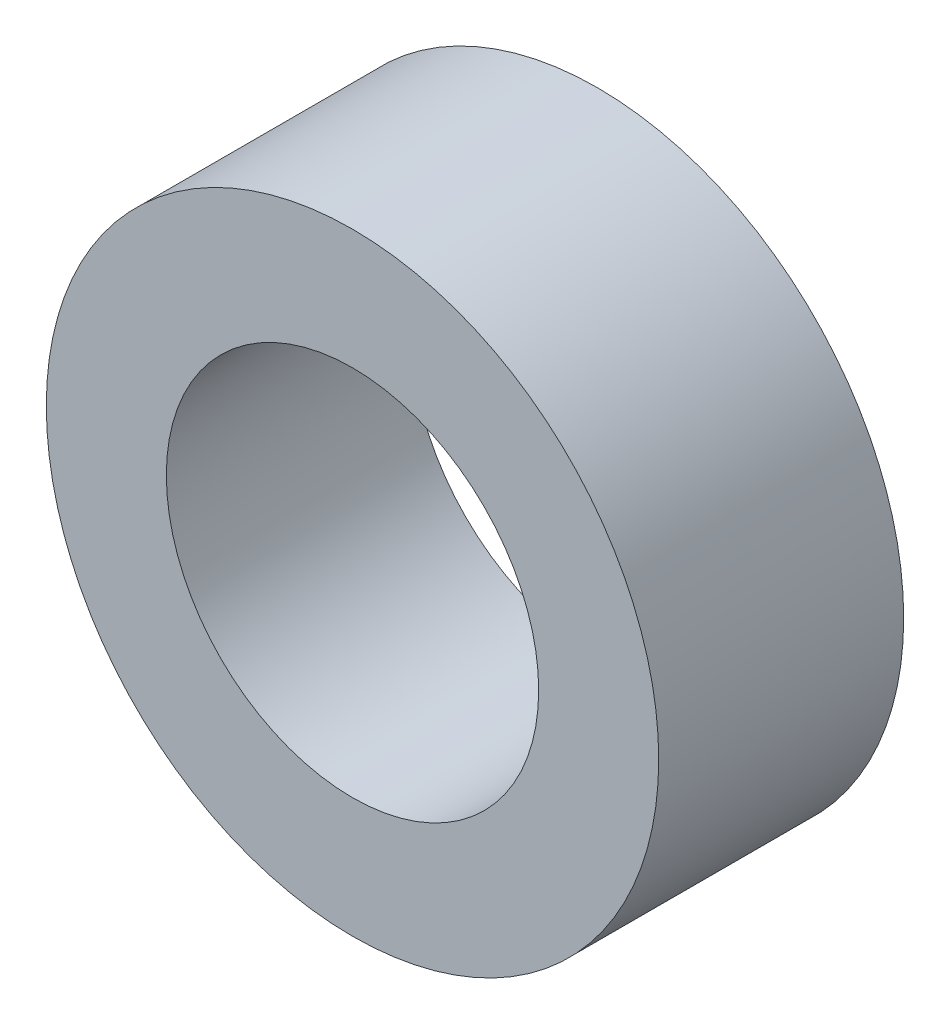
ISO-10303-21;
HEADER;
FILE_DESCRIPTION(('STEP AP214'),'2;1');
FILE_NAME('part.step','',(''),(''),'','','');
FILE_SCHEMA(('AUTOMOTIVE_DESIGN { 1 0 10303 214 1 1 1 1 }'));
ENDSEC;
DATA;
#1=APPLICATION_CONTEXT('core data for automotive mechanical design processes');
#2=APPLICATION_PROTOCOL_DEFINITION('international standard','automotive_design',2000,#1);
#3=PRODUCT_CONTEXT('',#1,'mechanical');
#4=PRODUCT('Part','Part','',(#3));
#5=PRODUCT_RELATED_PRODUCT_CATEGORY('part','',(#4));
#6=PRODUCT_DEFINITION_FORMATION('','',#4);
#7=PRODUCT_DEFINITION_CONTEXT('part definition',#1,'design');
#8=PRODUCT_DEFINITION('design','',#6,#7);
#9=PRODUCT_DEFINITION_SHAPE('','',#8);
#10=(LENGTH_UNIT() NAMED_UNIT(*) SI_UNIT(.MILLI.,.METRE.));
#11=(NAMED_UNIT(*) PLANE_ANGLE_UNIT() SI_UNIT($,.RADIAN.));
#12=(NAMED_UNIT(*) SI_UNIT($,.STERADIAN.) SOLID_ANGLE_UNIT());
#13=UNCERTAINTY_MEASURE_WITH_UNIT(LENGTH_MEASURE(1.E-05),#10,'distance_accuracy_value','');
#14=(GEOMETRIC_REPRESENTATION_CONTEXT(3) GLOBAL_UNCERTAINTY_ASSIGNED_CONTEXT((#13)) GLOBAL_UNIT_ASSIGNED_CONTEXT((#10,
#11,#12)) REPRESENTATION_CONTEXT('',''));
#15=CARTESIAN_POINT('',(0.,0.,0.));
#16=DIRECTION('',(0.,0.,1.));
#17=DIRECTION('',(1.,0.,0.));
#18=AXIS2_PLACEMENT_3D('',#15,#16,#17);
#19=CARTESIAN_POINT('',(0.,0.,-152.4));
#20=DIRECTION('',(0.,0.,1.));
#21=DIRECTION('',(1.,0.,0.));
#22=AXIS2_PLACEMENT_3D('',#19,#20,#21);
#23=CYLINDRICAL_SURFACE('',#22,7.9375);
#24=CARTESIAN_POINT('',(0.,0.,-152.4));
#25=DIRECTION('',(0.,0.,1.));
#26=DIRECTION('',(1.,0.,0.));
#27=AXIS2_PLACEMENT_3D('',#24,#25,#26);
#28=CIRCLE('',#27,7.9375);
#29=CARTESIAN_POINT('',(7.9375,0.,-152.4));
#30=VERTEX_POINT('',#29);
#31=EDGE_CURVE('E10',#30,#30,#28,.T.);
#32=CARTESIAN_POINT('',(0.,0.,-146.05));
#33=DIRECTION('',(0.,0.,1.));
#34=DIRECTION('',(1.,0.,0.));
#35=AXIS2_PLACEMENT_3D('',#32,#33,#34);
#36=CIRCLE('',#35,7.9375);
#37=CARTESIAN_POINT('',(7.9375,0.,-146.05));
#38=VERTEX_POINT('',#37);
#39=EDGE_CURVE('E47',#38,#38,#36,.T.);
#40=CARTESIAN_POINT('',(7.9375,0.,-152.4));
#41=CARTESIAN_POINT('',(7.9375,0.,-152.333854166667));
#42=CARTESIAN_POINT('',(7.9375,0.,-152.267708333333));
#43=CARTESIAN_POINT('',(7.9375,0.,-152.135416666667));
#44=CARTESIAN_POINT('',(7.9375,0.,-152.069270833333));
#45=CARTESIAN_POINT('',(7.9375,0.,-151.936979166667));
#46=CARTESIAN_POINT('',(7.9375,0.,-151.870833333333));
#47=CARTESIAN_POINT('',(7.9375,0.,-151.738541666667));
#48=CARTESIAN_POINT('',(7.9375,0.,-151.672395833333));
#49=CARTESIAN_POINT('',(7.9375,0.,-151.540104166667));
#50=CARTESIAN_POINT('',(7.9375,0.,-151.473958333333));
#51=CARTESIAN_POINT('',(7.9375,0.,-151.341666666667));
#52=CARTESIAN_POINT('',(7.9375,0.,-151.275520833333));
#53=CARTESIAN_POINT('',(7.9375,0.,-151.143229166667));
#54=CARTESIAN_POINT('',(7.9375,0.,-151.077083333333));
#55=CARTESIAN_POINT('',(7.9375,0.,-150.944791666667));
#56=CARTESIAN_POINT('',(7.9375,0.,-150.878645833333));
#57=CARTESIAN_POINT('',(7.9375,0.,-150.746354166667));
#58=CARTESIAN_POINT('',(7.9375,0.,-150.680208333333));
#59=CARTESIAN_POINT('',(7.9375,0.,-150.547916666667));
#60=CARTESIAN_POINT('',(7.9375,0.,-150.481770833333));
#61=CARTESIAN_POINT('',(7.9375,0.,-150.349479166667));
#62=CARTESIAN_POINT('',(7.9375,0.,-150.283333333333));
#63=CARTESIAN_POINT('',(7.9375,0.,-150.151041666667));
#64=CARTESIAN_POINT('',(7.9375,0.,-150.084895833333));
#65=CARTESIAN_POINT('',(7.9375,0.,-149.952604166667));
#66=CARTESIAN_POINT('',(7.9375,0.,-149.886458333333));
#67=CARTESIAN_POINT('',(7.9375,0.,-149.754166666667));
#68=CARTESIAN_POINT('',(7.9375,0.,-149.688020833333));
#69=CARTESIAN_POINT('',(7.9375,0.,-149.555729166667));
#70=CARTESIAN_POINT('',(7.9375,0.,-149.489583333333));
#71=CARTESIAN_POINT('',(7.9375,0.,-149.357291666667));
#72=CARTESIAN_POINT('',(7.9375,0.,-149.291145833333));
#73=CARTESIAN_POINT('',(7.9375,0.,-149.158854166667));
#74=CARTESIAN_POINT('',(7.9375,0.,-149.092708333333));
#75=CARTESIAN_POINT('',(7.9375,0.,-148.960416666667));
#76=CARTESIAN_POINT('',(7.9375,0.,-148.894270833333));
#77=CARTESIAN_POINT('',(7.9375,0.,-148.761979166667));
#78=CARTESIAN_POINT('',(7.9375,0.,-148.695833333333));
#79=CARTESIAN_POINT('',(7.9375,0.,-148.563541666667));
#80=CARTESIAN_POINT('',(7.9375,0.,-148.497395833333));
#81=CARTESIAN_POINT('',(7.9375,0.,-148.365104166667));
#82=CARTESIAN_POINT('',(7.9375,0.,-148.298958333333));
#83=CARTESIAN_POINT('',(7.9375,0.,-148.166666666667));
#84=CARTESIAN_POINT('',(7.9375,0.,-148.100520833333));
#85=CARTESIAN_POINT('',(7.9375,0.,-147.968229166667));
#86=CARTESIAN_POINT('',(7.9375,0.,-147.902083333333));
#87=CARTESIAN_POINT('',(7.9375,0.,-147.769791666667));
#88=CARTESIAN_POINT('',(7.9375,0.,-147.703645833333));
#89=CARTESIAN_POINT('',(7.9375,0.,-147.571354166667));
#90=CARTESIAN_POINT('',(7.9375,0.,-147.505208333333));
#91=CARTESIAN_POINT('',(7.9375,0.,-147.372916666667));
#92=CARTESIAN_POINT('',(7.9375,0.,-147.306770833333));
#93=CARTESIAN_POINT('',(7.9375,0.,-147.174479166667));
#94=CARTESIAN_POINT('',(7.9375,0.,-147.108333333333));
#95=CARTESIAN_POINT('',(7.9375,0.,-146.976041666667));
#96=CARTESIAN_POINT('',(7.9375,0.,-146.909895833333));
#97=CARTESIAN_POINT('',(7.9375,0.,-146.777604166667));
#98=CARTESIAN_POINT('',(7.9375,0.,-146.711458333333));
#99=CARTESIAN_POINT('',(7.9375,0.,-146.579166666667));
#100=CARTESIAN_POINT('',(7.9375,0.,-146.513020833333));
#101=CARTESIAN_POINT('',(7.9375,0.,-146.380729166667));
#102=CARTESIAN_POINT('',(7.9375,0.,-146.314583333333));
#103=CARTESIAN_POINT('',(7.9375,0.,-146.182291666667));
#104=CARTESIAN_POINT('',(7.9375,0.,-146.116145833333));
#105=CARTESIAN_POINT('',(7.9375,0.,-146.05));
#106=B_SPLINE_CURVE_WITH_KNOTS('',3,(#40,#41,#42,#43,#44,#45,#46,#47,#48,#49,#50,#51,#52,#53,
#54,#55,#56,#57,#58,#59,#60,#61,#62,#63,#64,#65,#66,#67,#68,#69,#70,#71,#72,#73,#74,#75,#76,#77,
#78,#79,#80,#81,#82,#83,#84,#85,#86,#87,#88,#89,#90,#91,#92,#93,#94,#95,#96,#97,#98,#99,#100,
#101,#102,#103,#104,#105),.UNSPECIFIED.,.F.,.F.,(4,2,2,2,2,2,2,2,2,2,2,2,2,2,2,2,2,2,2,2,2,2,2,
2,2,2,2,2,2,2,2,2,4),(0.,0.198437500000009,0.396875000000019,0.595312500000028,0.79375000000001,
0.992187500000019,1.19062500000003,1.38906250000001,1.58750000000002,1.78593750000003,
1.98437500000001,2.18281250000002,2.38125000000003,2.57968750000001,2.77812500000002,
2.97656250000003,3.17500000000004,3.37343750000002,3.57187500000003,3.77031250000004,
3.96875000000002,4.16718750000003,4.36562500000004,4.56406250000002,4.76250000000003,
4.96093750000004,5.15937500000002,5.35781250000003,5.55625000000004,5.75468750000002,
5.95312500000003,6.15156250000004,6.35000000000005),.UNSPECIFIED.);
#107=EDGE_CURVE('BSEAM34',#30,#38,#106,.T.);
#108=ORIENTED_EDGE('',*,*,#31,.T.);
#109=ORIENTED_EDGE('',*,*,#39,.F.);
#110=ORIENTED_EDGE('',*,*,#107,.T.);
#111=ORIENTED_EDGE('',*,*,#107,.F.);
#112=EDGE_LOOP('',(#108,#110,#109,#111));
#113=FACE_BOUND('',#112,.T.);
#114=ADVANCED_FACE('F34',(#113),#23,.T.);
#115=CARTESIAN_POINT('',(0.,0.,-152.4));
#116=DIRECTION('',(0.,0.,1.));
#117=DIRECTION('',(1.,0.,0.));
#118=AXIS2_PLACEMENT_3D('',#115,#116,#117);
#119=CYLINDRICAL_SURFACE('',#118,4.826);
#120=CARTESIAN_POINT('',(0.,0.,-152.4));
#121=DIRECTION('',(0.,0.,1.));
#122=DIRECTION('',(1.,0.,0.));
#123=AXIS2_PLACEMENT_3D('',#120,#121,#122);
#124=CIRCLE('',#123,4.826);
#125=CARTESIAN_POINT('',(4.826,0.,-152.4));
#126=VERTEX_POINT('',#125);
#127=EDGE_CURVE('E41',#126,#126,#124,.T.);
#128=CARTESIAN_POINT('',(0.,0.,-146.05));
#129=DIRECTION('',(0.,0.,1.));
#130=DIRECTION('',(1.,0.,0.));
#131=AXIS2_PLACEMENT_3D('',#128,#129,#130);
#132=CIRCLE('',#131,4.826);
#133=CARTESIAN_POINT('',(4.826,0.,-146.05));
#134=VERTEX_POINT('',#133);
#135=EDGE_CURVE('E37',#134,#134,#132,.F.);
#136=CARTESIAN_POINT('',(4.826,0.,-152.4));
#137=CARTESIAN_POINT('',(4.826,0.,-152.333854166667));
#138=CARTESIAN_POINT('',(4.826,0.,-152.267708333333));
#139=CARTESIAN_POINT('',(4.826,0.,-152.135416666667));
#140=CARTESIAN_POINT('',(4.826,0.,-152.069270833333));
#141=CARTESIAN_POINT('',(4.826,0.,-151.936979166667));
#142=CARTESIAN_POINT('',(4.826,0.,-151.870833333333));
#143=CARTESIAN_POINT('',(4.826,0.,-151.738541666667));
#144=CARTESIAN_POINT('',(4.826,0.,-151.672395833333));
#145=CARTESIAN_POINT('',(4.826,0.,-151.540104166667));
#146=CARTESIAN_POINT('',(4.826,0.,-151.473958333333));
#147=CARTESIAN_POINT('',(4.826,0.,-151.341666666667));
#148=CARTESIAN_POINT('',(4.826,0.,-151.275520833333));
#149=CARTESIAN_POINT('',(4.826,0.,-151.143229166667));
#150=CARTESIAN_POINT('',(4.826,0.,-151.077083333333));
#151=CARTESIAN_POINT('',(4.826,0.,-150.944791666667));
#152=CARTESIAN_POINT('',(4.826,0.,-150.878645833333));
#153=CARTESIAN_POINT('',(4.826,0.,-150.746354166667));
#154=CARTESIAN_POINT('',(4.826,0.,-150.680208333333));
#155=CARTESIAN_POINT('',(4.826,0.,-150.547916666667));
#156=CARTESIAN_POINT('',(4.826,0.,-150.481770833333));
#157=CARTESIAN_POINT('',(4.826,0.,-150.349479166667));
#158=CARTESIAN_POINT('',(4.826,0.,-150.283333333333));
#159=CARTESIAN_POINT('',(4.826,0.,-150.151041666667));
#160=CARTESIAN_POINT('',(4.826,0.,-150.084895833333));
#161=CARTESIAN_POINT('',(4.826,0.,-149.952604166667));
#162=CARTESIAN_POINT('',(4.826,0.,-149.886458333333));
#163=CARTESIAN_POINT('',(4.826,0.,-149.754166666667));
#164=CARTESIAN_POINT('',(4.826,0.,-149.688020833333));
#165=CARTESIAN_POINT('',(4.826,0.,-149.555729166667));
#166=CARTESIAN_POINT('',(4.826,0.,-149.489583333333));
#167=CARTESIAN_POINT('',(4.826,0.,-149.357291666667));
#168=CARTESIAN_POINT('',(4.826,0.,-149.291145833333));
#169=CARTESIAN_POINT('',(4.826,0.,-149.158854166667));
#170=CARTESIAN_POINT('',(4.826,0.,-149.092708333333));
#171=CARTESIAN_POINT('',(4.826,0.,-148.960416666667));
#172=CARTESIAN_POINT('',(4.826,0.,-148.894270833333));
#173=CARTESIAN_POINT('',(4.826,0.,-148.761979166667));
#174=CARTESIAN_POINT('',(4.826,0.,-148.695833333333));
#175=CARTESIAN_POINT('',(4.826,0.,-148.563541666667));
#176=CARTESIAN_POINT('',(4.826,0.,-148.497395833333));
#177=CARTESIAN_POINT('',(4.826,0.,-148.365104166667));
#178=CARTESIAN_POINT('',(4.826,0.,-148.298958333333));
#179=CARTESIAN_POINT('',(4.826,0.,-148.166666666667));
#180=CARTESIAN_POINT('',(4.826,0.,-148.100520833333));
#181=CARTESIAN_POINT('',(4.826,0.,-147.968229166667));
#182=CARTESIAN_POINT('',(4.826,0.,-147.902083333333));
#183=CARTESIAN_POINT('',(4.826,0.,-147.769791666667));
#184=CARTESIAN_POINT('',(4.826,0.,-147.703645833333));
#185=CARTESIAN_POINT('',(4.826,0.,-147.571354166667));
#186=CARTESIAN_POINT('',(4.826,0.,-147.505208333333));
#187=CARTESIAN_POINT('',(4.826,0.,-147.372916666667));
#188=CARTESIAN_POINT('',(4.826,0.,-147.306770833333));
#189=CARTESIAN_POINT('',(4.826,0.,-147.174479166667));
#190=CARTESIAN_POINT('',(4.826,0.,-147.108333333333));
#191=CARTESIAN_POINT('',(4.826,0.,-146.976041666667));
#192=CARTESIAN_POINT('',(4.826,0.,-146.909895833333));
#193=CARTESIAN_POINT('',(4.826,0.,-146.777604166667));
#194=CARTESIAN_POINT('',(4.826,0.,-146.711458333333));
#195=CARTESIAN_POINT('',(4.826,0.,-146.579166666667));
#196=CARTESIAN_POINT('',(4.826,0.,-146.513020833333));
#197=CARTESIAN_POINT('',(4.826,0.,-146.380729166667));
#198=CARTESIAN_POINT('',(4.826,0.,-146.314583333333));
#199=CARTESIAN_POINT('',(4.826,0.,-146.182291666667));
#200=CARTESIAN_POINT('',(4.826,0.,-146.116145833333));
#201=CARTESIAN_POINT('',(4.826,0.,-146.05));
#202=B_SPLINE_CURVE_WITH_KNOTS('',3,(#136,#137,#138,#139,#140,#141,#142,#143,#144,#145,#146,
#147,#148,#149,#150,#151,#152,#153,#154,#155,#156,#157,#158,#159,#160,#161,#162,#163,#164,#165,
#166,#167,#168,#169,#170,#171,#172,#173,#174,#175,#176,#177,#178,#179,#180,#181,#182,#183,#184,
#185,#186,#187,#188,#189,#190,#191,#192,#193,#194,#195,#196,#197,#198,#199,#200,#201),
.UNSPECIFIED.,.F.,.F.,(4,2,2,2,2,2,2,2,2,2,2,2,2,2,2,2,2,2,2,2,2,2,2,2,2,2,2,2,2,2,2,2,4),(0.,
0.198437500000009,0.396875000000019,0.595312500000028,0.79375000000001,0.992187500000019,
1.19062500000003,1.38906250000001,1.58750000000002,1.78593750000003,1.98437500000001,
2.18281250000002,2.38125000000003,2.57968750000001,2.77812500000002,2.97656250000003,
3.17500000000004,3.37343750000002,3.57187500000003,3.77031250000004,3.96875000000002,
4.16718750000003,4.36562500000004,4.56406250000002,4.76250000000003,4.96093750000004,
5.15937500000002,5.35781250000003,5.55625000000004,5.75468750000002,5.95312500000003,
6.15156250000004,6.35000000000005),.UNSPECIFIED.);
#203=EDGE_CURVE('BSEAM56',#126,#134,#202,.T.);
#204=ORIENTED_EDGE('',*,*,#127,.F.);
#205=ORIENTED_EDGE('',*,*,#135,.F.);
#206=ORIENTED_EDGE('',*,*,#203,.T.);
#207=ORIENTED_EDGE('',*,*,#203,.F.);
#208=EDGE_LOOP('',(#204,#206,#205,#207));
#209=FACE_BOUND('',#208,.T.);
#210=ADVANCED_FACE('F56',(#209),#119,.F.);
#211=CARTESIAN_POINT('',(0.,0.,-152.4));
#212=DIRECTION('',(0.,0.,1.));
#213=DIRECTION('',(1.,0.,0.));
#214=AXIS2_PLACEMENT_3D('',#211,#212,#213);
#215=PLANE('',#214);
#216=ORIENTED_EDGE('',*,*,#127,.T.);
#217=EDGE_LOOP('',(#216));
#218=FACE_BOUND('',#217,.T.);
#219=ORIENTED_EDGE('',*,*,#31,.F.);
#220=EDGE_LOOP('',(#219));
#221=FACE_BOUND('',#220,.T.);
#222=ADVANCED_FACE('F58',(#218,#221),#215,.F.);
#223=CARTESIAN_POINT('',(0.,0.,-146.05));
#224=DIRECTION('',(0.,0.,1.));
#225=DIRECTION('',(1.,0.,0.));
#226=AXIS2_PLACEMENT_3D('',#223,#224,#225);
#227=PLANE('',#226);
#228=ORIENTED_EDGE('',*,*,#39,.T.);
#229=EDGE_LOOP('',(#228));
#230=FACE_BOUND('',#229,.T.);
#231=ORIENTED_EDGE('',*,*,#135,.T.);
#232=EDGE_LOOP('',(#231));
#233=FACE_BOUND('',#232,.T.);
#234=ADVANCED_FACE('F54',(#230,#233),#227,.T.);
#235=CLOSED_SHELL('',(#114,#210,#222,#234));
#236=MANIFOLD_SOLID_BREP('B2',#235);
#237=ADVANCED_BREP_SHAPE_REPRESENTATION('',(#18,#236),#14);
#238=SHAPE_DEFINITION_REPRESENTATION(#9,#237);
ENDSEC;
END-ISO-10303-21;
